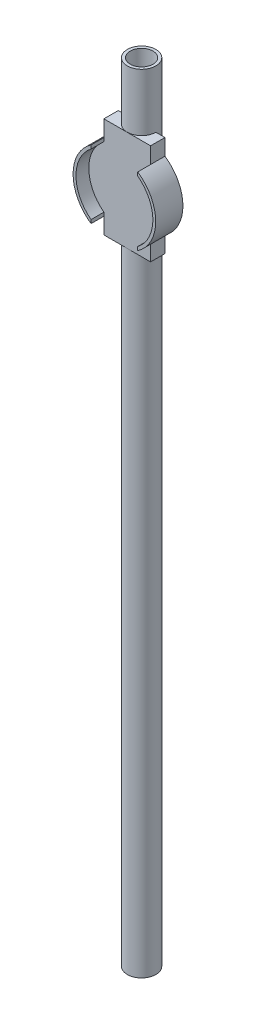
ISO-10303-21;
HEADER;
FILE_DESCRIPTION(('STEP AP214'),'2;1');
FILE_NAME('part.step','',(''),(''),'','','');
FILE_SCHEMA(('AUTOMOTIVE_DESIGN { 1 0 10303 214 1 1 1 1 }'));
ENDSEC;
DATA;
#1=APPLICATION_CONTEXT('core data for automotive mechanical design processes');
#2=APPLICATION_PROTOCOL_DEFINITION('international standard','automotive_design',2000,#1);
#3=PRODUCT_CONTEXT('',#1,'mechanical');
#4=PRODUCT('Part','Part','',(#3));
#5=PRODUCT_RELATED_PRODUCT_CATEGORY('part','',(#4));
#6=PRODUCT_DEFINITION_FORMATION('','',#4);
#7=PRODUCT_DEFINITION_CONTEXT('part definition',#1,'design');
#8=PRODUCT_DEFINITION('design','',#6,#7);
#9=PRODUCT_DEFINITION_SHAPE('','',#8);
#10=(LENGTH_UNIT() NAMED_UNIT(*) SI_UNIT(.MILLI.,.METRE.));
#11=(NAMED_UNIT(*) PLANE_ANGLE_UNIT() SI_UNIT($,.RADIAN.));
#12=(NAMED_UNIT(*) SI_UNIT($,.STERADIAN.) SOLID_ANGLE_UNIT());
#13=UNCERTAINTY_MEASURE_WITH_UNIT(LENGTH_MEASURE(1.E-05),#10,'distance_accuracy_value','');
#14=(GEOMETRIC_REPRESENTATION_CONTEXT(3) GLOBAL_UNCERTAINTY_ASSIGNED_CONTEXT((#13)) GLOBAL_UNIT_ASSIGNED_CONTEXT((#10,
#11,#12)) REPRESENTATION_CONTEXT('',''));
#15=CARTESIAN_POINT('',(0.,0.,0.));
#16=DIRECTION('',(0.,0.,1.));
#17=DIRECTION('',(1.,0.,0.));
#18=AXIS2_PLACEMENT_3D('',#15,#16,#17);
#19=CARTESIAN_POINT('',(0.,0.,4.));
#20=DIRECTION('',(0.,0.,1.));
#21=DIRECTION('',(1.,0.,0.));
#22=AXIS2_PLACEMENT_3D('',#19,#20,#21);
#23=PLANE('',#22);
#24=DIRECTION('',(0.,1.,0.));
#25=VECTOR('',#24,1.);
#26=CARTESIAN_POINT('',(-6.49999999999997,0.,4.));
#27=LINE('',#26,#25);
#28=CARTESIAN_POINT('',(-6.49999999999997,-120.766832980505,4.));
#29=VERTEX_POINT('',#28);
#30=CARTESIAN_POINT('',(-6.49999999999997,-119.77941174435,4.));
#31=VERTEX_POINT('',#30);
#32=EDGE_CURVE('E196',#29,#31,#27,.T.);
#33=ORIENTED_EDGE('',*,*,#32,.F.);
#34=DIRECTION('',(0.,-1.,0.));
#35=VECTOR('',#34,1.);
#36=CARTESIAN_POINT('',(-6.49999999999998,0.,4.));
#37=LINE('',#36,#35);
#38=CARTESIAN_POINT('',(-6.49999999999997,-125.28,4.));
#39=VERTEX_POINT('',#38);
#40=EDGE_CURVE('E266',#29,#39,#37,.T.);
#41=ORIENTED_EDGE('',*,*,#40,.T.);
#42=DIRECTION('',(1.,0.,0.));
#43=VECTOR('',#42,1.);
#44=CARTESIAN_POINT('',(0.,-125.28,4.));
#45=LINE('',#44,#43);
#46=CARTESIAN_POINT('',(6.50000000000003,-125.28,4.));
#47=VERTEX_POINT('',#46);
#48=EDGE_CURVE('E269',#39,#47,#45,.T.);
#49=ORIENTED_EDGE('',*,*,#48,.T.);
#50=DIRECTION('',(0.,-1.,0.));
#51=VECTOR('',#50,1.);
#52=CARTESIAN_POINT('',(6.50000000000001,0.,4.));
#53=LINE('',#52,#51);
#54=CARTESIAN_POINT('',(6.50000000000002,-120.766832980505,4.));
#55=VERTEX_POINT('',#54);
#56=EDGE_CURVE('E250',#55,#47,#53,.T.);
#57=ORIENTED_EDGE('',*,*,#56,.F.);
#58=DIRECTION('',(0.,1.,0.));
#59=VECTOR('',#58,1.);
#60=CARTESIAN_POINT('',(6.50000000000003,0.,4.));
#61=LINE('',#60,#59);
#62=CARTESIAN_POINT('',(6.50000000000003,-119.77941174435,4.));
#63=VERTEX_POINT('',#62);
#64=EDGE_CURVE('E234',#55,#63,#61,.T.);
#65=ORIENTED_EDGE('',*,*,#64,.T.);
#66=CARTESIAN_POINT('',(0.,-111.28,4.));
#67=DIRECTION('',(0.,0.,1.));
#68=DIRECTION('',(1.,0.,0.));
#69=AXIS2_PLACEMENT_3D('',#66,#67,#68);
#70=CIRCLE('',#69,10.7);
#71=CARTESIAN_POINT('',(6.50000000000003,-102.780588255649,4.));
#72=VERTEX_POINT('',#71);
#73=EDGE_CURVE('E230',#63,#72,#70,.T.);
#74=ORIENTED_EDGE('',*,*,#73,.T.);
#75=CARTESIAN_POINT('',(6.50000000000003,-101.793167019494,4.));
#76=VERTEX_POINT('',#75);
#77=EDGE_CURVE('E222',#72,#76,#61,.T.);
#78=ORIENTED_EDGE('',*,*,#77,.T.);
#79=DIRECTION('',(0.,-1.,0.));
#80=VECTOR('',#79,1.);
#81=CARTESIAN_POINT('',(6.50000000000001,0.,4.));
#82=LINE('',#81,#80);
#83=CARTESIAN_POINT('',(6.50000000000003,-97.2799999999996,4.));
#84=VERTEX_POINT('',#83);
#85=EDGE_CURVE('E254',#84,#76,#82,.T.);
#86=ORIENTED_EDGE('',*,*,#85,.F.);
#87=DIRECTION('',(1.,0.,0.));
#88=VECTOR('',#87,1.);
#89=CARTESIAN_POINT('',(0.,-97.2799999999996,4.));
#90=LINE('',#89,#88);
#91=CARTESIAN_POINT('',(-6.49999999999997,-97.2799999999996,4.));
#92=VERTEX_POINT('',#91);
#93=EDGE_CURVE('E259',#92,#84,#90,.T.);
#94=ORIENTED_EDGE('',*,*,#93,.F.);
#95=DIRECTION('',(0.,-1.,0.));
#96=VECTOR('',#95,1.);
#97=CARTESIAN_POINT('',(-6.49999999999998,0.,4.));
#98=LINE('',#97,#96);
#99=CARTESIAN_POINT('',(-6.49999999999997,-101.793167019494,4.));
#100=VERTEX_POINT('',#99);
#101=EDGE_CURVE('E263',#92,#100,#98,.T.);
#102=ORIENTED_EDGE('',*,*,#101,.T.);
#103=CARTESIAN_POINT('',(-6.49999999999997,-102.780588255649,4.));
#104=VERTEX_POINT('',#103);
#105=EDGE_CURVE('E68',#104,#100,#27,.T.);
#106=ORIENTED_EDGE('',*,*,#105,.F.);
#107=CARTESIAN_POINT('',(0.,-111.28,4.));
#108=DIRECTION('',(0.,0.,1.));
#109=DIRECTION('',(1.,0.,0.));
#110=AXIS2_PLACEMENT_3D('',#107,#108,#109);
#111=CIRCLE('',#110,10.7);
#112=EDGE_CURVE('E63',#104,#31,#111,.T.);
#113=ORIENTED_EDGE('',*,*,#112,.T.);
#114=EDGE_LOOP('',(#33,#41,#49,#57,#65,#74,#78,#86,#94,#102,#106,#113));
#115=FACE_BOUND('',#114,.T.);
#116=ADVANCED_FACE('F47',(#115),#23,.T.);
#117=CARTESIAN_POINT('',(0.,0.,0.));
#118=DIRECTION('',(0.,1.,0.));
#119=DIRECTION('',(-1.,0.,0.));
#120=AXIS2_PLACEMENT_3D('',#117,#118,#119);
#121=CYLINDRICAL_SURFACE('',#120,3.17499999999998);
#122=CARTESIAN_POINT('',(0.,-81.2799999999996,0.));
#123=DIRECTION('',(0.,1.,0.));
#124=DIRECTION('',(-1.,0.,0.));
#125=AXIS2_PLACEMENT_3D('',#122,#123,#124);
#126=CIRCLE('',#125,3.17499999999999);
#127=CARTESIAN_POINT('',(-3.17499999999998,-81.2799999999996,0.));
#128=VERTEX_POINT('',#127);
#129=EDGE_CURVE('E359',#128,#128,#126,.T.);
#130=ORIENTED_EDGE('',*,*,#129,.T.);
#131=EDGE_LOOP('',(#130));
#132=FACE_BOUND('',#131,.T.);
#133=CARTESIAN_POINT('',(0.,-300.368379857382,0.));
#134=DIRECTION('',(0.,1.,0.));
#135=DIRECTION('',(-1.,0.,0.));
#136=AXIS2_PLACEMENT_3D('',#133,#134,#135);
#137=CIRCLE('',#136,3.17499999999997);
#138=CARTESIAN_POINT('',(-3.17499999999993,-300.368379857382,0.));
#139=VERTEX_POINT('',#138);
#140=EDGE_CURVE('E347',#139,#139,#137,.T.);
#141=ORIENTED_EDGE('',*,*,#140,.F.);
#142=EDGE_LOOP('',(#141));
#143=FACE_BOUND('',#142,.T.);
#144=DIRECTION('',(0.,1.,0.));
#145=VECTOR('',#144,1.);
#146=CARTESIAN_POINT('',(3.17499999999998,0.,0.));
#147=LINE('',#146,#145);
#148=CARTESIAN_POINT('',(3.17499999999999,-97.2799999999996,0.));
#149=VERTEX_POINT('',#148);
#150=CARTESIAN_POINT('',(3.175,-125.28,0.));
#151=VERTEX_POINT('',#150);
#152=EDGE_CURVE('E336',#149,#151,#147,.F.);
#153=ORIENTED_EDGE('',*,*,#152,.F.);
#154=CARTESIAN_POINT('',(0.,-97.2799999999996,0.));
#155=DIRECTION('',(0.,1.,0.));
#156=DIRECTION('',(0.,0.,1.));
#157=AXIS2_PLACEMENT_3D('',#154,#155,#156);
#158=CIRCLE('',#157,3.17499999999998);
#159=CARTESIAN_POINT('',(-3.17499999999997,-97.2799999999996,0.));
#160=VERTEX_POINT('',#159);
#161=EDGE_CURVE('E344',#149,#160,#158,.F.);
#162=ORIENTED_EDGE('',*,*,#161,.T.);
#163=DIRECTION('',(0.,1.,0.));
#164=VECTOR('',#163,1.);
#165=CARTESIAN_POINT('',(-3.17499999999998,0.,0.));
#166=LINE('',#165,#164);
#167=CARTESIAN_POINT('',(-3.17499999999997,-125.28,0.));
#168=VERTEX_POINT('',#167);
#169=EDGE_CURVE('E332',#168,#160,#166,.T.);
#170=ORIENTED_EDGE('',*,*,#169,.F.);
#171=CARTESIAN_POINT('',(0.,-125.28,0.));
#172=DIRECTION('',(0.,1.,0.));
#173=DIRECTION('',(0.,0.,1.));
#174=AXIS2_PLACEMENT_3D('',#171,#172,#173);
#175=CIRCLE('',#174,3.17499999999998);
#176=EDGE_CURVE('E340',#151,#168,#175,.F.);
#177=ORIENTED_EDGE('',*,*,#176,.F.);
#178=EDGE_LOOP('',(#153,#162,#170,#177));
#179=FACE_BOUND('',#178,.T.);
#180=ADVANCED_FACE('F49',(#132,#143,#179),#121,.F.);
#181=CARTESIAN_POINT('',(0.,0.,0.));
#182=DIRECTION('',(0.,1.,0.));
#183=DIRECTION('',(-1.,0.,0.));
#184=AXIS2_PLACEMENT_3D('',#181,#182,#183);
#185=CYLINDRICAL_SURFACE('',#184,3.97499999999998);
#186=CARTESIAN_POINT('',(0.,-300.368379857382,0.));
#187=DIRECTION('',(0.,1.,0.));
#188=DIRECTION('',(-1.,0.,0.));
#189=AXIS2_PLACEMENT_3D('',#186,#187,#188);
#190=CIRCLE('',#189,3.97499999999997);
#191=CARTESIAN_POINT('',(-3.97499999999993,-300.368379857382,0.));
#192=VERTEX_POINT('',#191);
#193=EDGE_CURVE('E351',#192,#192,#190,.T.);
#194=ORIENTED_EDGE('',*,*,#193,.T.);
#195=EDGE_LOOP('',(#194));
#196=FACE_BOUND('',#195,.T.);
#197=CARTESIAN_POINT('',(0.,-81.2799999999996,0.));
#198=DIRECTION('',(0.,1.,0.));
#199=DIRECTION('',(-1.,0.,0.));
#200=AXIS2_PLACEMENT_3D('',#197,#198,#199);
#201=CIRCLE('',#200,3.975);
#202=CARTESIAN_POINT('',(-3.97499999999999,-81.2799999999996,0.));
#203=VERTEX_POINT('',#202);
#204=EDGE_CURVE('E355',#203,#203,#201,.T.);
#205=ORIENTED_EDGE('',*,*,#204,.F.);
#206=EDGE_LOOP('',(#205));
#207=FACE_BOUND('',#206,.T.);
#208=DIRECTION('',(0.,1.,0.));
#209=VECTOR('',#208,1.);
#210=CARTESIAN_POINT('',(3.97499999999998,0.,0.));
#211=LINE('',#210,#209);
#212=CARTESIAN_POINT('',(3.975,-125.28,0.));
#213=VERTEX_POINT('',#212);
#214=CARTESIAN_POINT('',(3.97499999999999,-97.2799999999996,0.));
#215=VERTEX_POINT('',#214);
#216=EDGE_CURVE('E11',#213,#215,#211,.T.);
#217=ORIENTED_EDGE('',*,*,#216,.F.);
#218=CARTESIAN_POINT('',(0.,-125.28,0.));
#219=DIRECTION('',(0.,1.,0.));
#220=DIRECTION('',(0.,0.,1.));
#221=AXIS2_PLACEMENT_3D('',#218,#219,#220);
#222=CIRCLE('',#221,3.97499999999998);
#223=CARTESIAN_POINT('',(-3.97499999999997,-125.28,0.));
#224=VERTEX_POINT('',#223);
#225=EDGE_CURVE('E367',#224,#213,#222,.T.);
#226=ORIENTED_EDGE('',*,*,#225,.F.);
#227=DIRECTION('',(0.,1.,0.));
#228=VECTOR('',#227,1.);
#229=CARTESIAN_POINT('',(-3.97499999999998,0.,0.));
#230=LINE('',#229,#228);
#231=CARTESIAN_POINT('',(-3.97499999999997,-97.2799999999996,0.));
#232=VERTEX_POINT('',#231);
#233=EDGE_CURVE('E363',#232,#224,#230,.F.);
#234=ORIENTED_EDGE('',*,*,#233,.F.);
#235=CARTESIAN_POINT('',(0.,-97.2799999999996,0.));
#236=DIRECTION('',(0.,1.,0.));
#237=DIRECTION('',(0.,0.,1.));
#238=AXIS2_PLACEMENT_3D('',#235,#236,#237);
#239=CIRCLE('',#238,3.97499999999998);
#240=EDGE_CURVE('E56',#232,#215,#239,.T.);
#241=ORIENTED_EDGE('',*,*,#240,.T.);
#242=EDGE_LOOP('',(#217,#226,#234,#241));
#243=FACE_BOUND('',#242,.T.);
#244=ADVANCED_FACE('F373',(#196,#207,#243),#185,.T.);
#245=CARTESIAN_POINT('',(3.175,-81.2799999999996,0.));
#246=DIRECTION('',(0.,-1.,0.));
#247=DIRECTION('',(1.,0.,0.));
#248=AXIS2_PLACEMENT_3D('',#245,#246,#247);
#249=PLANE('',#248);
#250=ORIENTED_EDGE('',*,*,#129,.F.);
#251=EDGE_LOOP('',(#250));
#252=FACE_BOUND('',#251,.T.);
#253=ORIENTED_EDGE('',*,*,#204,.T.);
#254=EDGE_LOOP('',(#253));
#255=FACE_BOUND('',#254,.T.);
#256=ADVANCED_FACE('F686',(#252,#255),#249,.F.);
#257=CARTESIAN_POINT('',(3.175,-300.368379857382,0.));
#258=DIRECTION('',(0.,1.,0.));
#259=DIRECTION('',(-1.,0.,0.));
#260=AXIS2_PLACEMENT_3D('',#257,#258,#259);
#261=PLANE('',#260);
#262=ORIENTED_EDGE('',*,*,#193,.F.);
#263=EDGE_LOOP('',(#262));
#264=FACE_BOUND('',#263,.T.);
#265=ORIENTED_EDGE('',*,*,#140,.T.);
#266=EDGE_LOOP('',(#265));
#267=FACE_BOUND('',#266,.T.);
#268=ADVANCED_FACE('F457',(#264,#267),#261,.F.);
#269=CARTESIAN_POINT('',(0.,-125.28,4.));
#270=DIRECTION('',(0.,1.,0.));
#271=DIRECTION('',(0.,0.,1.));
#272=AXIS2_PLACEMENT_3D('',#269,#270,#271);
#273=PLANE('',#272);
#274=DIRECTION('',(1.,0.,0.));
#275=VECTOR('',#274,1.);
#276=CARTESIAN_POINT('',(0.,-125.28,0.));
#277=LINE('',#276,#275);
#278=CARTESIAN_POINT('',(-6.49999999999997,-125.28,0.));
#279=VERTEX_POINT('',#278);
#280=EDGE_CURVE('E255',#279,#224,#277,.T.);
#281=ORIENTED_EDGE('',*,*,#280,.T.);
#282=ORIENTED_EDGE('',*,*,#225,.T.);
#283=CARTESIAN_POINT('',(6.50000000000003,-125.28,0.));
#284=VERTEX_POINT('',#283);
#285=EDGE_CURVE('E299',#213,#284,#277,.T.);
#286=ORIENTED_EDGE('',*,*,#285,.T.);
#287=DIRECTION('',(0.,0.,-1.));
#288=VECTOR('',#287,1.);
#289=CARTESIAN_POINT('',(6.50000000000003,-125.28,4.));
#290=LINE('',#289,#288);
#291=EDGE_CURVE('E272',#47,#284,#290,.T.);
#292=ORIENTED_EDGE('',*,*,#291,.F.);
#293=ORIENTED_EDGE('',*,*,#48,.F.);
#294=DIRECTION('',(0.,0.,-1.));
#295=VECTOR('',#294,1.);
#296=CARTESIAN_POINT('',(-6.49999999999997,-125.28,4.));
#297=LINE('',#296,#295);
#298=EDGE_CURVE('E307',#39,#279,#297,.T.);
#299=ORIENTED_EDGE('',*,*,#298,.T.);
#300=EDGE_LOOP('',(#281,#282,#286,#292,#293,#299));
#301=FACE_BOUND('',#300,.T.);
#302=ADVANCED_FACE('F400',(#301),#273,.F.);
#303=CARTESIAN_POINT('',(-6.49999999999998,0.,4.));
#304=DIRECTION('',(1.,0.,0.));
#305=DIRECTION('',(0.,1.,0.));
#306=AXIS2_PLACEMENT_3D('',#303,#304,#305);
#307=PLANE('',#306);
#308=DIRECTION('',(0.,-1.,0.));
#309=VECTOR('',#308,1.);
#310=CARTESIAN_POINT('',(-6.49999999999998,0.,0.));
#311=LINE('',#310,#309);
#312=CARTESIAN_POINT('',(-6.49999999999997,-120.766832980505,0.));
#313=VERTEX_POINT('',#312);
#314=EDGE_CURVE('E296',#313,#279,#311,.T.);
#315=ORIENTED_EDGE('',*,*,#314,.T.);
#316=ORIENTED_EDGE('',*,*,#298,.F.);
#317=ORIENTED_EDGE('',*,*,#40,.F.);
#318=DIRECTION('',(0.,0.,-1.));
#319=VECTOR('',#318,1.);
#320=CARTESIAN_POINT('',(-6.49999999999997,-120.766832980505,4.));
#321=LINE('',#320,#319);
#322=EDGE_CURVE('E311',#29,#313,#321,.T.);
#323=ORIENTED_EDGE('',*,*,#322,.T.);
#324=EDGE_LOOP('',(#315,#316,#317,#323));
#325=FACE_BOUND('',#324,.T.);
#326=ADVANCED_FACE('F456',(#325),#307,.F.);
#327=CARTESIAN_POINT('',(0.,-111.28,4.));
#328=DIRECTION('',(0.,0.,-1.));
#329=DIRECTION('',(-1.,0.,0.));
#330=AXIS2_PLACEMENT_3D('',#327,#328,#329);
#331=CYLINDRICAL_SURFACE('',#330,11.5);
#332=CARTESIAN_POINT('',(0.,-111.28,0.));
#333=DIRECTION('',(0.,0.,1.));
#334=DIRECTION('',(1.,0.,0.));
#335=AXIS2_PLACEMENT_3D('',#332,#333,#334);
#336=CIRCLE('',#335,11.5);
#337=CARTESIAN_POINT('',(-6.49999999999997,-101.793167019494,0.));
#338=VERTEX_POINT('',#337);
#339=EDGE_CURVE('E293',#338,#313,#336,.T.);
#340=ORIENTED_EDGE('',*,*,#339,.T.);
#341=ORIENTED_EDGE('',*,*,#322,.F.);
#342=DIRECTION('',(0.,0.,-1.));
#343=VECTOR('',#342,1.);
#344=CARTESIAN_POINT('',(-6.49999999999997,-120.766832980505,7.575));
#345=LINE('',#344,#343);
#346=CARTESIAN_POINT('',(-6.49999999999997,-120.766832980505,7.575));
#347=VERTEX_POINT('',#346);
#348=EDGE_CURVE('E211',#347,#29,#345,.T.);
#349=ORIENTED_EDGE('',*,*,#348,.F.);
#350=CARTESIAN_POINT('',(0.,-111.28,7.575));
#351=DIRECTION('',(0.,0.,1.));
#352=DIRECTION('',(1.,0.,0.));
#353=AXIS2_PLACEMENT_3D('',#350,#351,#352);
#354=CIRCLE('',#353,11.5);
#355=CARTESIAN_POINT('',(-6.49999999999997,-101.793167019494,7.575));
#356=VERTEX_POINT('',#355);
#357=EDGE_CURVE('E189',#356,#347,#354,.T.);
#358=ORIENTED_EDGE('',*,*,#357,.F.);
#359=DIRECTION('',(0.,0.,-1.));
#360=VECTOR('',#359,1.);
#361=CARTESIAN_POINT('',(-6.49999999999997,-101.793167019494,7.575));
#362=LINE('',#361,#360);
#363=EDGE_CURVE('E180',#356,#100,#362,.T.);
#364=ORIENTED_EDGE('',*,*,#363,.T.);
#365=DIRECTION('',(0.,0.,-1.));
#366=VECTOR('',#365,1.);
#367=CARTESIAN_POINT('',(-6.49999999999997,-101.793167019494,4.));
#368=LINE('',#367,#366);
#369=EDGE_CURVE('E315',#100,#338,#368,.T.);
#370=ORIENTED_EDGE('',*,*,#369,.T.);
#371=EDGE_LOOP('',(#340,#341,#349,#358,#364,#370));
#372=FACE_BOUND('',#371,.T.);
#373=ADVANCED_FACE('F459',(#372),#331,.T.);
#374=CARTESIAN_POINT('',(-6.49999999999998,0.,4.));
#375=DIRECTION('',(1.,0.,0.));
#376=DIRECTION('',(0.,1.,0.));
#377=AXIS2_PLACEMENT_3D('',#374,#375,#376);
#378=PLANE('',#377);
#379=DIRECTION('',(0.,-1.,0.));
#380=VECTOR('',#379,1.);
#381=CARTESIAN_POINT('',(-6.49999999999998,0.,0.));
#382=LINE('',#381,#380);
#383=CARTESIAN_POINT('',(-6.49999999999997,-97.2799999999996,0.));
#384=VERTEX_POINT('',#383);
#385=EDGE_CURVE('E289',#384,#338,#382,.T.);
#386=ORIENTED_EDGE('',*,*,#385,.T.);
#387=ORIENTED_EDGE('',*,*,#369,.F.);
#388=ORIENTED_EDGE('',*,*,#101,.F.);
#389=DIRECTION('',(0.,0.,-1.));
#390=VECTOR('',#389,1.);
#391=CARTESIAN_POINT('',(-6.49999999999997,-97.2799999999996,4.));
#392=LINE('',#391,#390);
#393=EDGE_CURVE('E319',#92,#384,#392,.T.);
#394=ORIENTED_EDGE('',*,*,#393,.T.);
#395=EDGE_LOOP('',(#386,#387,#388,#394));
#396=FACE_BOUND('',#395,.T.);
#397=ADVANCED_FACE('F426',(#396),#378,.F.);
#398=CARTESIAN_POINT('',(0.,-97.2799999999996,4.));
#399=DIRECTION('',(0.,1.,0.));
#400=DIRECTION('',(0.,0.,1.));
#401=AXIS2_PLACEMENT_3D('',#398,#399,#400);
#402=PLANE('',#401);
#403=ORIENTED_EDGE('',*,*,#240,.F.);
#404=DIRECTION('',(1.,0.,0.));
#405=VECTOR('',#404,1.);
#406=CARTESIAN_POINT('',(0.,-97.2799999999996,0.));
#407=LINE('',#406,#405);
#408=EDGE_CURVE('E285',#384,#232,#407,.T.);
#409=ORIENTED_EDGE('',*,*,#408,.F.);
#410=ORIENTED_EDGE('',*,*,#393,.F.);
#411=ORIENTED_EDGE('',*,*,#93,.T.);
#412=DIRECTION('',(0.,0.,-1.));
#413=VECTOR('',#412,1.);
#414=CARTESIAN_POINT('',(6.50000000000003,-97.2799999999996,4.));
#415=LINE('',#414,#413);
#416=CARTESIAN_POINT('',(6.50000000000003,-97.2799999999996,0.));
#417=VERTEX_POINT('',#416);
#418=EDGE_CURVE('E322',#84,#417,#415,.T.);
#419=ORIENTED_EDGE('',*,*,#418,.T.);
#420=EDGE_CURVE('E284',#215,#417,#407,.T.);
#421=ORIENTED_EDGE('',*,*,#420,.F.);
#422=EDGE_LOOP('',(#403,#409,#410,#411,#419,#421));
#423=FACE_BOUND('',#422,.T.);
#424=ADVANCED_FACE('F380',(#423),#402,.T.);
#425=CARTESIAN_POINT('',(6.50000000000001,0.,4.));
#426=DIRECTION('',(1.,0.,0.));
#427=DIRECTION('',(0.,1.,0.));
#428=AXIS2_PLACEMENT_3D('',#425,#426,#427);
#429=PLANE('',#428);
#430=DIRECTION('',(0.,-1.,0.));
#431=VECTOR('',#430,1.);
#432=CARTESIAN_POINT('',(6.50000000000001,0.,0.));
#433=LINE('',#432,#431);
#434=CARTESIAN_POINT('',(6.50000000000003,-101.793167019494,0.));
#435=VERTEX_POINT('',#434);
#436=EDGE_CURVE('E280',#417,#435,#433,.T.);
#437=ORIENTED_EDGE('',*,*,#436,.F.);
#438=ORIENTED_EDGE('',*,*,#418,.F.);
#439=ORIENTED_EDGE('',*,*,#85,.T.);
#440=DIRECTION('',(0.,0.,-1.));
#441=VECTOR('',#440,1.);
#442=CARTESIAN_POINT('',(6.50000000000003,-101.793167019494,4.));
#443=LINE('',#442,#441);
#444=EDGE_CURVE('E326',#76,#435,#443,.T.);
#445=ORIENTED_EDGE('',*,*,#444,.T.);
#446=EDGE_LOOP('',(#437,#438,#439,#445));
#447=FACE_BOUND('',#446,.T.);
#448=ADVANCED_FACE('F431',(#447),#429,.T.);
#449=CARTESIAN_POINT('',(0.,-111.28,4.));
#450=DIRECTION('',(0.,0.,-1.));
#451=DIRECTION('',(-1.,0.,0.));
#452=AXIS2_PLACEMENT_3D('',#449,#450,#451);
#453=CYLINDRICAL_SURFACE('',#452,11.5);
#454=CARTESIAN_POINT('',(0.,-111.28,0.));
#455=DIRECTION('',(0.,0.,1.));
#456=DIRECTION('',(1.,0.,0.));
#457=AXIS2_PLACEMENT_3D('',#454,#455,#456);
#458=CIRCLE('',#457,11.5);
#459=CARTESIAN_POINT('',(6.50000000000003,-120.766832980505,0.));
#460=VERTEX_POINT('',#459);
#461=EDGE_CURVE('E276',#460,#435,#458,.T.);
#462=ORIENTED_EDGE('',*,*,#461,.T.);
#463=ORIENTED_EDGE('',*,*,#444,.F.);
#464=DIRECTION('',(0.,0.,-1.));
#465=VECTOR('',#464,1.);
#466=CARTESIAN_POINT('',(6.50000000000003,-101.793167019494,7.575));
#467=LINE('',#466,#465);
#468=CARTESIAN_POINT('',(6.50000000000003,-101.793167019494,7.575));
#469=VERTEX_POINT('',#468);
#470=EDGE_CURVE('E241',#469,#76,#467,.T.);
#471=ORIENTED_EDGE('',*,*,#470,.F.);
#472=CARTESIAN_POINT('',(0.,-111.28,7.575));
#473=DIRECTION('',(0.,0.,1.));
#474=DIRECTION('',(1.,0.,0.));
#475=AXIS2_PLACEMENT_3D('',#472,#473,#474);
#476=CIRCLE('',#475,11.5);
#477=CARTESIAN_POINT('',(6.50000000000002,-120.766832980505,7.575));
#478=VERTEX_POINT('',#477);
#479=EDGE_CURVE('E226',#478,#469,#476,.T.);
#480=ORIENTED_EDGE('',*,*,#479,.F.);
#481=DIRECTION('',(0.,0.,-1.));
#482=VECTOR('',#481,1.);
#483=CARTESIAN_POINT('',(6.50000000000002,-120.766832980505,7.575));
#484=LINE('',#483,#482);
#485=EDGE_CURVE('E244',#478,#55,#484,.T.);
#486=ORIENTED_EDGE('',*,*,#485,.T.);
#487=DIRECTION('',(0.,0.,-1.));
#488=VECTOR('',#487,1.);
#489=CARTESIAN_POINT('',(6.50000000000003,-120.766832980505,4.));
#490=LINE('',#489,#488);
#491=EDGE_CURVE('E329',#55,#460,#490,.T.);
#492=ORIENTED_EDGE('',*,*,#491,.T.);
#493=EDGE_LOOP('',(#462,#463,#471,#480,#486,#492));
#494=FACE_BOUND('',#493,.T.);
#495=ADVANCED_FACE('F410',(#494),#453,.T.);
#496=CARTESIAN_POINT('',(6.50000000000001,0.,4.));
#497=DIRECTION('',(1.,0.,0.));
#498=DIRECTION('',(0.,1.,0.));
#499=AXIS2_PLACEMENT_3D('',#496,#497,#498);
#500=PLANE('',#499);
#501=DIRECTION('',(0.,-1.,0.));
#502=VECTOR('',#501,1.);
#503=CARTESIAN_POINT('',(6.50000000000001,0.,0.));
#504=LINE('',#503,#502);
#505=EDGE_CURVE('E179',#460,#284,#504,.T.);
#506=ORIENTED_EDGE('',*,*,#505,.F.);
#507=ORIENTED_EDGE('',*,*,#491,.F.);
#508=ORIENTED_EDGE('',*,*,#56,.T.);
#509=ORIENTED_EDGE('',*,*,#291,.T.);
#510=EDGE_LOOP('',(#506,#507,#508,#509));
#511=FACE_BOUND('',#510,.T.);
#512=ADVANCED_FACE('F404',(#511),#500,.T.);
#513=CARTESIAN_POINT('',(0.,0.,0.));
#514=DIRECTION('',(0.,0.,1.));
#515=DIRECTION('',(1.,0.,0.));
#516=AXIS2_PLACEMENT_3D('',#513,#514,#515);
#517=PLANE('',#516);
#518=ORIENTED_EDGE('',*,*,#408,.T.);
#519=ORIENTED_EDGE('',*,*,#233,.T.);
#520=ORIENTED_EDGE('',*,*,#280,.F.);
#521=ORIENTED_EDGE('',*,*,#314,.F.);
#522=ORIENTED_EDGE('',*,*,#339,.F.);
#523=ORIENTED_EDGE('',*,*,#385,.F.);
#524=EDGE_LOOP('',(#518,#519,#520,#521,#522,#523));
#525=FACE_BOUND('',#524,.T.);
#526=ADVANCED_FACE('F420',(#525),#517,.F.);
#527=ORIENTED_EDGE('',*,*,#285,.F.);
#528=ORIENTED_EDGE('',*,*,#216,.T.);
#529=ORIENTED_EDGE('',*,*,#420,.T.);
#530=ORIENTED_EDGE('',*,*,#436,.T.);
#531=ORIENTED_EDGE('',*,*,#461,.F.);
#532=ORIENTED_EDGE('',*,*,#505,.T.);
#533=EDGE_LOOP('',(#527,#528,#529,#530,#531,#532));
#534=FACE_BOUND('',#533,.T.);
#535=ADVANCED_FACE('F379',(#534),#517,.F.);
#536=ORIENTED_EDGE('',*,*,#161,.F.);
#537=EDGE_CURVE('E290',#160,#149,#407,.T.);
#538=ORIENTED_EDGE('',*,*,#537,.F.);
#539=EDGE_LOOP('',(#536,#538));
#540=FACE_BOUND('',#539,.T.);
#541=ADVANCED_FACE('F392',(#540),#402,.T.);
#542=EDGE_CURVE('E303',#168,#151,#277,.T.);
#543=ORIENTED_EDGE('',*,*,#542,.T.);
#544=ORIENTED_EDGE('',*,*,#176,.T.);
#545=EDGE_LOOP('',(#543,#544));
#546=FACE_BOUND('',#545,.T.);
#547=ADVANCED_FACE('F395',(#546),#273,.F.);
#548=ORIENTED_EDGE('',*,*,#537,.T.);
#549=ORIENTED_EDGE('',*,*,#152,.T.);
#550=ORIENTED_EDGE('',*,*,#542,.F.);
#551=ORIENTED_EDGE('',*,*,#169,.T.);
#552=EDGE_LOOP('',(#548,#549,#550,#551));
#553=FACE_BOUND('',#552,.T.);
#554=ADVANCED_FACE('F387',(#553),#517,.F.);
#555=CARTESIAN_POINT('',(0.,-111.28,7.575));
#556=DIRECTION('',(0.,0.,-1.));
#557=DIRECTION('',(-1.,0.,0.));
#558=AXIS2_PLACEMENT_3D('',#555,#556,#557);
#559=CYLINDRICAL_SURFACE('',#558,10.7);
#560=ORIENTED_EDGE('',*,*,#73,.F.);
#561=DIRECTION('',(0.,0.,-1.));
#562=VECTOR('',#561,1.);
#563=CARTESIAN_POINT('',(6.50000000000003,-119.77941174435,7.575));
#564=LINE('',#563,#562);
#565=CARTESIAN_POINT('',(6.50000000000003,-119.77941174435,7.575));
#566=VERTEX_POINT('',#565);
#567=EDGE_CURVE('E205',#566,#63,#564,.T.);
#568=ORIENTED_EDGE('',*,*,#567,.F.);
#569=CARTESIAN_POINT('',(0.,-111.28,7.575));
#570=DIRECTION('',(0.,0.,1.));
#571=DIRECTION('',(1.,0.,0.));
#572=AXIS2_PLACEMENT_3D('',#569,#570,#571);
#573=CIRCLE('',#572,10.7);
#574=CARTESIAN_POINT('',(6.50000000000003,-102.780588255649,7.575));
#575=VERTEX_POINT('',#574);
#576=EDGE_CURVE('E217',#566,#575,#573,.T.);
#577=ORIENTED_EDGE('',*,*,#576,.T.);
#578=DIRECTION('',(0.,0.,-1.));
#579=VECTOR('',#578,1.);
#580=CARTESIAN_POINT('',(6.50000000000003,-102.780588255649,7.575));
#581=LINE('',#580,#579);
#582=EDGE_CURVE('E238',#575,#72,#581,.T.);
#583=ORIENTED_EDGE('',*,*,#582,.T.);
#584=EDGE_LOOP('',(#560,#568,#577,#583));
#585=FACE_BOUND('',#584,.T.);
#586=ADVANCED_FACE('F451',(#585),#559,.F.);
#587=CARTESIAN_POINT('',(6.50000000000003,0.,7.575));
#588=DIRECTION('',(-1.,0.,0.));
#589=DIRECTION('',(0.,0.,1.));
#590=AXIS2_PLACEMENT_3D('',#587,#588,#589);
#591=PLANE('',#590);
#592=ORIENTED_EDGE('',*,*,#64,.F.);
#593=ORIENTED_EDGE('',*,*,#485,.F.);
#594=DIRECTION('',(0.,1.,0.));
#595=VECTOR('',#594,1.);
#596=CARTESIAN_POINT('',(6.50000000000003,0.,7.575));
#597=LINE('',#596,#595);
#598=EDGE_CURVE('E221',#478,#566,#597,.T.);
#599=ORIENTED_EDGE('',*,*,#598,.T.);
#600=ORIENTED_EDGE('',*,*,#567,.T.);
#601=EDGE_LOOP('',(#592,#593,#599,#600));
#602=FACE_BOUND('',#601,.T.);
#603=ADVANCED_FACE('F555',(#602),#591,.T.);
#604=ORIENTED_EDGE('',*,*,#77,.F.);
#605=ORIENTED_EDGE('',*,*,#582,.F.);
#606=EDGE_CURVE('E227',#575,#469,#597,.T.);
#607=ORIENTED_EDGE('',*,*,#606,.T.);
#608=ORIENTED_EDGE('',*,*,#470,.T.);
#609=EDGE_LOOP('',(#604,#605,#607,#608));
#610=FACE_BOUND('',#609,.T.);
#611=ADVANCED_FACE('F564',(#610),#591,.T.);
#612=CARTESIAN_POINT('',(0.,0.,7.575));
#613=DIRECTION('',(0.,0.,1.));
#614=DIRECTION('',(1.,0.,0.));
#615=AXIS2_PLACEMENT_3D('',#612,#613,#614);
#616=PLANE('',#615);
#617=ORIENTED_EDGE('',*,*,#576,.F.);
#618=ORIENTED_EDGE('',*,*,#598,.F.);
#619=ORIENTED_EDGE('',*,*,#479,.T.);
#620=ORIENTED_EDGE('',*,*,#606,.F.);
#621=EDGE_LOOP('',(#617,#618,#619,#620));
#622=FACE_BOUND('',#621,.T.);
#623=ADVANCED_FACE('F573',(#622),#616,.T.);
#624=CARTESIAN_POINT('',(0.,-111.28,7.575));
#625=DIRECTION('',(0.,0.,-1.));
#626=DIRECTION('',(-1.,0.,0.));
#627=AXIS2_PLACEMENT_3D('',#624,#625,#626);
#628=CYLINDRICAL_SURFACE('',#627,10.7);
#629=ORIENTED_EDGE('',*,*,#112,.F.);
#630=DIRECTION('',(0.,0.,-1.));
#631=VECTOR('',#630,1.);
#632=CARTESIAN_POINT('',(-6.49999999999997,-102.780588255649,7.575));
#633=LINE('',#632,#631);
#634=CARTESIAN_POINT('',(-6.49999999999997,-102.780588255649,7.575));
#635=VERTEX_POINT('',#634);
#636=EDGE_CURVE('E172',#635,#104,#633,.T.);
#637=ORIENTED_EDGE('',*,*,#636,.F.);
#638=CARTESIAN_POINT('',(0.,-111.28,7.575));
#639=DIRECTION('',(0.,0.,1.));
#640=DIRECTION('',(1.,0.,0.));
#641=AXIS2_PLACEMENT_3D('',#638,#639,#640);
#642=CIRCLE('',#641,10.7);
#643=CARTESIAN_POINT('',(-6.49999999999997,-119.77941174435,7.575));
#644=VERTEX_POINT('',#643);
#645=EDGE_CURVE('E176',#635,#644,#642,.T.);
#646=ORIENTED_EDGE('',*,*,#645,.T.);
#647=DIRECTION('',(0.,0.,-1.));
#648=VECTOR('',#647,1.);
#649=CARTESIAN_POINT('',(-6.49999999999997,-119.77941174435,7.575));
#650=LINE('',#649,#648);
#651=EDGE_CURVE('E208',#644,#31,#650,.T.);
#652=ORIENTED_EDGE('',*,*,#651,.T.);
#653=EDGE_LOOP('',(#629,#637,#646,#652));
#654=FACE_BOUND('',#653,.T.);
#655=ADVANCED_FACE('F174',(#654),#628,.F.);
#656=CARTESIAN_POINT('',(-6.49999999999997,0.,7.575));
#657=DIRECTION('',(-1.,0.,0.));
#658=DIRECTION('',(0.,0.,1.));
#659=AXIS2_PLACEMENT_3D('',#656,#657,#658);
#660=PLANE('',#659);
#661=ORIENTED_EDGE('',*,*,#105,.T.);
#662=ORIENTED_EDGE('',*,*,#363,.F.);
#663=DIRECTION('',(0.,1.,0.));
#664=VECTOR('',#663,1.);
#665=CARTESIAN_POINT('',(-6.49999999999997,0.,7.575));
#666=LINE('',#665,#664);
#667=EDGE_CURVE('E183',#635,#356,#666,.T.);
#668=ORIENTED_EDGE('',*,*,#667,.F.);
#669=ORIENTED_EDGE('',*,*,#636,.T.);
#670=EDGE_LOOP('',(#661,#662,#668,#669));
#671=FACE_BOUND('',#670,.T.);
#672=ADVANCED_FACE('F184',(#671),#660,.F.);
#673=ORIENTED_EDGE('',*,*,#32,.T.);
#674=ORIENTED_EDGE('',*,*,#651,.F.);
#675=EDGE_CURVE('E191',#347,#644,#666,.T.);
#676=ORIENTED_EDGE('',*,*,#675,.F.);
#677=ORIENTED_EDGE('',*,*,#348,.T.);
#678=EDGE_LOOP('',(#673,#674,#676,#677));
#679=FACE_BOUND('',#678,.T.);
#680=ADVANCED_FACE('F599',(#679),#660,.F.);
#681=CARTESIAN_POINT('',(0.,0.,7.575));
#682=DIRECTION('',(0.,0.,1.));
#683=DIRECTION('',(1.,0.,0.));
#684=AXIS2_PLACEMENT_3D('',#681,#682,#683);
#685=PLANE('',#684);
#686=ORIENTED_EDGE('',*,*,#645,.F.);
#687=ORIENTED_EDGE('',*,*,#667,.T.);
#688=ORIENTED_EDGE('',*,*,#357,.T.);
#689=ORIENTED_EDGE('',*,*,#675,.T.);
#690=EDGE_LOOP('',(#686,#687,#688,#689));
#691=FACE_BOUND('',#690,.T.);
#692=ADVANCED_FACE('F192',(#691),#685,.T.);
#693=CLOSED_SHELL('',(#116,#180,#244,#256,#268,#302,#326,#373,#397,#424,#448,#495,#512,#526,
#535,#541,#547,#554,#586,#603,#611,#623,#655,#672,#680,#692));
#694=MANIFOLD_SOLID_BREP('B2',#693);
#695=ADVANCED_BREP_SHAPE_REPRESENTATION('',(#18,#694),#14);
#696=SHAPE_DEFINITION_REPRESENTATION(#9,#695);
ENDSEC;
END-ISO-10303-21;
